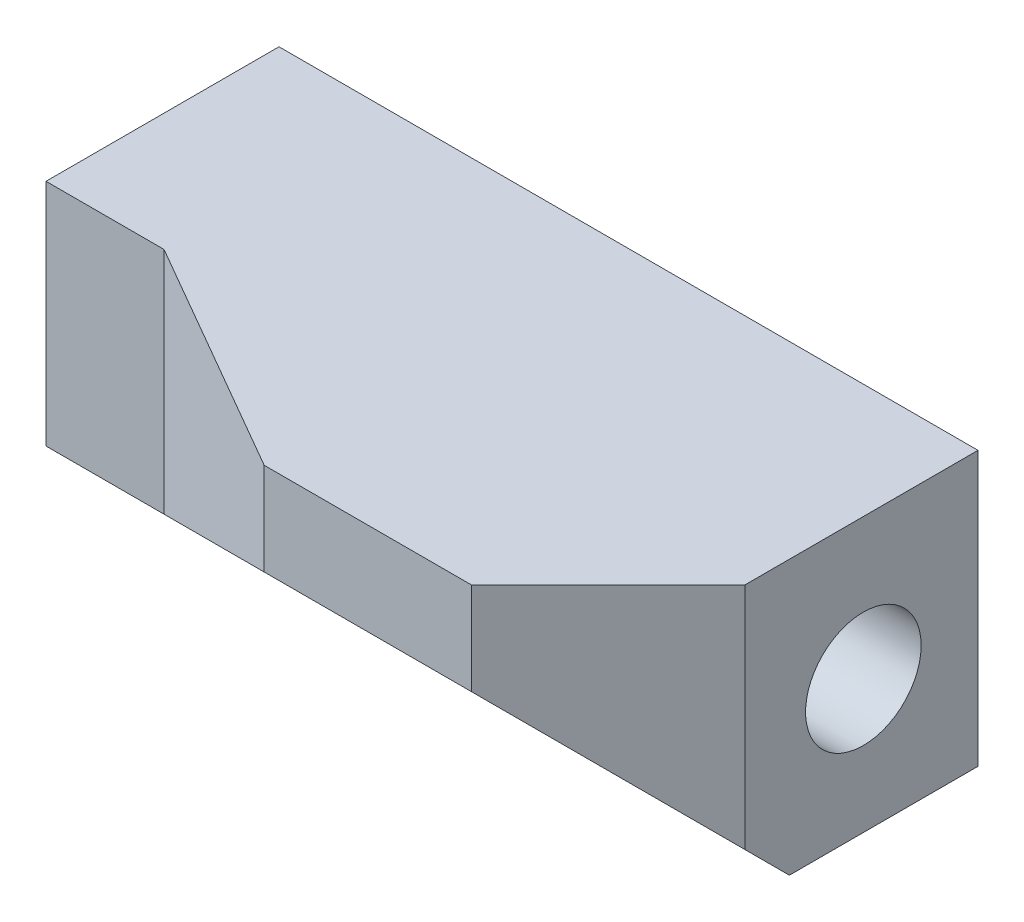
ISO-10303-21;
HEADER;
FILE_DESCRIPTION(('STEP AP214'),'2;1');
FILE_NAME('part.step','',(''),(''),'','','');
FILE_SCHEMA(('AUTOMOTIVE_DESIGN { 1 0 10303 214 1 1 1 1 }'));
ENDSEC;
DATA;
#1=APPLICATION_CONTEXT('core data for automotive mechanical design processes');
#2=APPLICATION_PROTOCOL_DEFINITION('international standard','automotive_design',2000,#1);
#3=PRODUCT_CONTEXT('',#1,'mechanical');
#4=PRODUCT('Part','Part','',(#3));
#5=PRODUCT_RELATED_PRODUCT_CATEGORY('part','',(#4));
#6=PRODUCT_DEFINITION_FORMATION('','',#4);
#7=PRODUCT_DEFINITION_CONTEXT('part definition',#1,'design');
#8=PRODUCT_DEFINITION('design','',#6,#7);
#9=PRODUCT_DEFINITION_SHAPE('','',#8);
#10=(LENGTH_UNIT() NAMED_UNIT(*) SI_UNIT(.MILLI.,.METRE.));
#11=(NAMED_UNIT(*) PLANE_ANGLE_UNIT() SI_UNIT($,.RADIAN.));
#12=(NAMED_UNIT(*) SI_UNIT($,.STERADIAN.) SOLID_ANGLE_UNIT());
#13=UNCERTAINTY_MEASURE_WITH_UNIT(LENGTH_MEASURE(1.E-05),#10,'distance_accuracy_value','');
#14=(GEOMETRIC_REPRESENTATION_CONTEXT(3) GLOBAL_UNCERTAINTY_ASSIGNED_CONTEXT((#13)) GLOBAL_UNIT_ASSIGNED_CONTEXT((#10,
#11,#12)) REPRESENTATION_CONTEXT('',''));
#15=CARTESIAN_POINT('',(0.,0.,0.));
#16=DIRECTION('',(0.,0.,1.));
#17=DIRECTION('',(1.,0.,0.));
#18=AXIS2_PLACEMENT_3D('',#15,#16,#17);
#19=CARTESIAN_POINT('',(-96.012,-31.75,31.7499999999999));
#20=DIRECTION('',(0.,-0.707106781186549,0.707106781186546));
#21=DIRECTION('',(0.,-0.707106781186546,-0.707106781186549));
#22=AXIS2_PLACEMENT_3D('',#19,#20,#21);
#23=PLANE('',#22);
#24=DIRECTION('',(0.,-0.707106781186546,-0.707106781186549));
#25=VECTOR('',#24,1.);
#26=CARTESIAN_POINT('',(0.,-31.75,31.7499999999999));
#27=LINE('',#26,#25);
#28=CARTESIAN_POINT('',(0.,-31.496,32.0039999999999));
#29=VERTEX_POINT('',#28);
#30=CARTESIAN_POINT('',(0.,-37.592,25.9079999999999));
#31=VERTEX_POINT('',#30);
#32=EDGE_CURVE('E198',#29,#31,#27,.T.);
#33=ORIENTED_EDGE('',*,*,#32,.F.);
#34=DIRECTION('',(-0.577350269189625,0.577350269189625,0.577350269189627));
#35=VECTOR('',#34,1.);
#36=CARTESIAN_POINT('',(-31.8346666666666,0.33866666666655,63.8386666666666));
#37=LINE('',#36,#35);
#38=CARTESIAN_POINT('',(-18.796,-12.7,50.8));
#39=VERTEX_POINT('',#38);
#40=EDGE_CURVE('E263',#29,#39,#37,.T.);
#41=ORIENTED_EDGE('',*,*,#40,.T.);
#42=DIRECTION('',(1.,0.,0.));
#43=VECTOR('',#42,1.);
#44=CARTESIAN_POINT('',(-96.012,-12.7,50.8));
#45=LINE('',#44,#43);
#46=CARTESIAN_POINT('',(-47.244,-12.7,50.8));
#47=VERTEX_POINT('',#46);
#48=EDGE_CURVE('E162',#47,#39,#45,.T.);
#49=ORIENTED_EDGE('',*,*,#48,.F.);
#50=DIRECTION('',(0.774596669241488,0.447213595499953,0.447213595499955));
#51=VECTOR('',#50,1.);
#52=CARTESIAN_POINT('',(-89.7030271536752,-37.2137307567036,26.2862692432963));
#53=LINE('',#52,#51);
#54=CARTESIAN_POINT('',(-79.7996269790651,-31.4959999999999,32.004));
#55=VERTEX_POINT('',#54);
#56=EDGE_CURVE('E288',#55,#47,#53,.T.);
#57=ORIENTED_EDGE('',*,*,#56,.F.);
#58=DIRECTION('',(1.,0.,0.));
#59=VECTOR('',#58,1.);
#60=CARTESIAN_POINT('',(-96.012,-31.4959999999999,32.004));
#61=LINE('',#60,#59);
#62=CARTESIAN_POINT('',(-96.012,-31.4959999999999,32.004));
#63=VERTEX_POINT('',#62);
#64=EDGE_CURVE('E291',#63,#55,#61,.T.);
#65=ORIENTED_EDGE('',*,*,#64,.F.);
#66=DIRECTION('',(0.,-0.707106781186546,-0.707106781186549));
#67=VECTOR('',#66,1.);
#68=CARTESIAN_POINT('',(-96.012,-31.75,31.7499999999999));
#69=LINE('',#68,#67);
#70=CARTESIAN_POINT('',(-96.012,-56.896,6.60399999999982));
#71=VERTEX_POINT('',#70);
#72=EDGE_CURVE('E209',#63,#71,#69,.T.);
#73=ORIENTED_EDGE('',*,*,#72,.T.);
#74=DIRECTION('',(1.,0.,0.));
#75=VECTOR('',#74,1.);
#76=CARTESIAN_POINT('',(-96.012,-56.896,6.60399999999982));
#77=LINE('',#76,#75);
#78=CARTESIAN_POINT('',(-70.612,-56.896,6.60399999999982));
#79=VERTEX_POINT('',#78);
#80=EDGE_CURVE('E186',#71,#79,#77,.T.);
#81=ORIENTED_EDGE('',*,*,#80,.T.);
#82=DIRECTION('',(0.,-0.707106781186546,-0.707106781186549));
#83=VECTOR('',#82,1.);
#84=CARTESIAN_POINT('',(-70.612,-31.75,31.7499999999999));
#85=LINE('',#84,#83);
#86=CARTESIAN_POINT('',(-70.612,-43.18,20.3199999999999));
#87=VERTEX_POINT('',#86);
#88=EDGE_CURVE('E233',#87,#79,#85,.T.);
#89=ORIENTED_EDGE('',*,*,#88,.F.);
#90=DIRECTION('',(-1.,0.,0.));
#91=VECTOR('',#90,1.);
#92=CARTESIAN_POINT('',(-96.012,-43.18,20.3199999999999));
#93=LINE('',#92,#91);
#94=CARTESIAN_POINT('',(-41.656,-43.18,20.3199999999999));
#95=VERTEX_POINT('',#94);
#96=EDGE_CURVE('E227',#95,#87,#93,.T.);
#97=ORIENTED_EDGE('',*,*,#96,.F.);
#98=DIRECTION('',(0.,0.707106781186546,0.707106781186549));
#99=VECTOR('',#98,1.);
#100=CARTESIAN_POINT('',(-41.656,-31.75,31.7499999999999));
#101=LINE('',#100,#99);
#102=CARTESIAN_POINT('',(-41.656,-56.896,6.60399999999983));
#103=VERTEX_POINT('',#102);
#104=EDGE_CURVE('E236',#103,#95,#101,.T.);
#105=ORIENTED_EDGE('',*,*,#104,.F.);
#106=CARTESIAN_POINT('',(-25.4,-56.896,6.60399999999982));
#107=VERTEX_POINT('',#106);
#108=EDGE_CURVE('E174',#103,#107,#77,.T.);
#109=ORIENTED_EDGE('',*,*,#108,.T.);
#110=DIRECTION('',(0.,0.707106781186546,0.707106781186549));
#111=VECTOR('',#110,1.);
#112=CARTESIAN_POINT('',(-25.4,-31.75,31.7499999999999));
#113=LINE('',#112,#111);
#114=CARTESIAN_POINT('',(-25.4,-37.592,25.9079999999999));
#115=VERTEX_POINT('',#114);
#116=EDGE_CURVE('E239',#107,#115,#113,.T.);
#117=ORIENTED_EDGE('',*,*,#116,.T.);
#118=DIRECTION('',(1.,0.,0.));
#119=VECTOR('',#118,1.);
#120=CARTESIAN_POINT('',(-96.012,-37.592,25.9079999999999));
#121=LINE('',#120,#119);
#122=EDGE_CURVE('E243',#115,#31,#121,.T.);
#123=ORIENTED_EDGE('',*,*,#122,.T.);
#124=EDGE_LOOP('',(#33,#41,#49,#57,#65,#73,#81,#89,#97,#105,#109,#117,#123));
#125=FACE_BOUND('',#124,.T.);
#126=ADVANCED_FACE('F45',(#125),#23,.T.);
#127=CARTESIAN_POINT('',(0.,0.,0.));
#128=DIRECTION('',(1.,0.,0.));
#129=DIRECTION('',(0.,0.,-1.));
#130=AXIS2_PLACEMENT_3D('',#127,#128,#129);
#131=PLANE('',#130);
#132=CARTESIAN_POINT('',(0.,-19.304,15.748));
#133=DIRECTION('',(1.,0.,0.));
#134=DIRECTION('',(0.,0.,-1.));
#135=AXIS2_PLACEMENT_3D('',#132,#133,#134);
#136=CIRCLE('',#135,7.9375);
#137=CARTESIAN_POINT('',(0.,-19.304,7.8105));
#138=VERTEX_POINT('',#137);
#139=EDGE_CURVE('E223',#138,#138,#136,.T.);
#140=ORIENTED_EDGE('',*,*,#139,.F.);
#141=EDGE_LOOP('',(#140));
#142=FACE_BOUND('',#141,.T.);
#143=DIRECTION('',(0.,0.,1.));
#144=VECTOR('',#143,1.);
#145=CARTESIAN_POINT('',(0.,0.,0.));
#146=LINE('',#145,#144);
#147=CARTESIAN_POINT('',(0.,0.,0.));
#148=VERTEX_POINT('',#147);
#149=CARTESIAN_POINT('',(0.,0.,32.0039999999999));
#150=VERTEX_POINT('',#149);
#151=EDGE_CURVE('E202',#148,#150,#146,.T.);
#152=ORIENTED_EDGE('',*,*,#151,.T.);
#153=DIRECTION('',(0.,1.,0.));
#154=VECTOR('',#153,1.);
#155=CARTESIAN_POINT('',(0.,-56.896,32.0039999999999));
#156=LINE('',#155,#154);
#157=EDGE_CURVE('E61',#29,#150,#156,.T.);
#158=ORIENTED_EDGE('',*,*,#157,.F.);
#159=ORIENTED_EDGE('',*,*,#32,.T.);
#160=DIRECTION('',(0.,0.,-1.));
#161=VECTOR('',#160,1.);
#162=CARTESIAN_POINT('',(0.,-37.592,0.));
#163=LINE('',#162,#161);
#164=CARTESIAN_POINT('',(0.,-37.592,0.));
#165=VERTEX_POINT('',#164);
#166=EDGE_CURVE('E54',#31,#165,#163,.T.);
#167=ORIENTED_EDGE('',*,*,#166,.T.);
#168=DIRECTION('',(0.,1.,0.));
#169=VECTOR('',#168,1.);
#170=CARTESIAN_POINT('',(0.,0.,0.));
#171=LINE('',#170,#169);
#172=EDGE_CURVE('E205',#165,#148,#171,.T.);
#173=ORIENTED_EDGE('',*,*,#172,.T.);
#174=EDGE_LOOP('',(#152,#158,#159,#167,#173));
#175=FACE_BOUND('',#174,.T.);
#176=ADVANCED_FACE('F338',(#142,#175),#131,.T.);
#177=CARTESIAN_POINT('',(-96.012,0.,50.8));
#178=DIRECTION('',(0.,0.,1.));
#179=DIRECTION('',(1.,0.,0.));
#180=AXIS2_PLACEMENT_3D('',#177,#178,#179);
#181=PLANE('',#180);
#182=ORIENTED_EDGE('',*,*,#48,.T.);
#183=DIRECTION('',(0.,1.,0.));
#184=VECTOR('',#183,1.);
#185=CARTESIAN_POINT('',(-18.796,-56.896,50.8));
#186=LINE('',#185,#184);
#187=CARTESIAN_POINT('',(-18.796,0.,50.8));
#188=VERTEX_POINT('',#187);
#189=EDGE_CURVE('E146',#39,#188,#186,.T.);
#190=ORIENTED_EDGE('',*,*,#189,.T.);
#191=DIRECTION('',(1.,0.,0.));
#192=VECTOR('',#191,1.);
#193=CARTESIAN_POINT('',(-96.012,0.,50.8));
#194=LINE('',#193,#192);
#195=CARTESIAN_POINT('',(-47.244,0.,50.8));
#196=VERTEX_POINT('',#195);
#197=EDGE_CURVE('E160',#196,#188,#194,.T.);
#198=ORIENTED_EDGE('',*,*,#197,.F.);
#199=DIRECTION('',(0.,1.,0.));
#200=VECTOR('',#199,1.);
#201=CARTESIAN_POINT('',(-47.244,-56.896,50.8));
#202=LINE('',#201,#200);
#203=EDGE_CURVE('E153',#47,#196,#202,.T.);
#204=ORIENTED_EDGE('',*,*,#203,.F.);
#205=EDGE_LOOP('',(#182,#190,#198,#204));
#206=FACE_BOUND('',#205,.T.);
#207=ADVANCED_FACE('F158',(#206),#181,.T.);
#208=CARTESIAN_POINT('',(-96.012,0.,0.));
#209=DIRECTION('',(0.,1.,0.));
#210=DIRECTION('',(0.,0.,1.));
#211=AXIS2_PLACEMENT_3D('',#208,#209,#210);
#212=PLANE('',#211);
#213=ORIENTED_EDGE('',*,*,#197,.T.);
#214=DIRECTION('',(0.707106781186546,0.,-0.707106781186549));
#215=VECTOR('',#214,1.);
#216=CARTESIAN_POINT('',(16.002,0.,16.0019999999999));
#217=LINE('',#216,#215);
#218=EDGE_CURVE('E143',#188,#150,#217,.T.);
#219=ORIENTED_EDGE('',*,*,#218,.T.);
#220=ORIENTED_EDGE('',*,*,#151,.F.);
#221=DIRECTION('',(1.,0.,0.));
#222=VECTOR('',#221,1.);
#223=CARTESIAN_POINT('',(-96.012,0.,0.));
#224=LINE('',#223,#222);
#225=CARTESIAN_POINT('',(-96.012,0.,0.));
#226=VERTEX_POINT('',#225);
#227=EDGE_CURVE('E170',#226,#148,#224,.T.);
#228=ORIENTED_EDGE('',*,*,#227,.F.);
#229=DIRECTION('',(0.,0.,1.));
#230=VECTOR('',#229,1.);
#231=CARTESIAN_POINT('',(-96.012,0.,0.));
#232=LINE('',#231,#230);
#233=CARTESIAN_POINT('',(-96.012,0.,32.004));
#234=VERTEX_POINT('',#233);
#235=EDGE_CURVE('E212',#226,#234,#232,.T.);
#236=ORIENTED_EDGE('',*,*,#235,.T.);
#237=DIRECTION('',(-1.,0.,0.));
#238=VECTOR('',#237,1.);
#239=CARTESIAN_POINT('',(0.,0.,32.004));
#240=LINE('',#239,#238);
#241=CARTESIAN_POINT('',(-79.7996269790651,0.,32.004));
#242=VERTEX_POINT('',#241);
#243=EDGE_CURVE('E69',#242,#234,#240,.T.);
#244=ORIENTED_EDGE('',*,*,#243,.F.);
#245=DIRECTION('',(-0.866025403784442,0.,-0.499999999999995));
#246=VECTOR('',#245,1.);
#247=CARTESIAN_POINT('',(-33.8080452561243,0.,58.5572520881961));
#248=LINE('',#247,#246);
#249=EDGE_CURVE('E168',#196,#242,#248,.T.);
#250=ORIENTED_EDGE('',*,*,#249,.F.);
#251=EDGE_LOOP('',(#213,#219,#220,#228,#236,#244,#250));
#252=FACE_BOUND('',#251,.T.);
#253=ADVANCED_FACE('F166',(#252),#212,.T.);
#254=CARTESIAN_POINT('',(-96.012,-56.896,0.));
#255=DIRECTION('',(0.,-1.,0.));
#256=DIRECTION('',(0.,0.,-1.));
#257=AXIS2_PLACEMENT_3D('',#254,#255,#256);
#258=PLANE('',#257);
#259=DIRECTION('',(0.,0.,-1.));
#260=VECTOR('',#259,1.);
#261=CARTESIAN_POINT('',(-70.612,-56.896,50.8));
#262=LINE('',#261,#260);
#263=CARTESIAN_POINT('',(-70.612,-56.896,0.));
#264=VERTEX_POINT('',#263);
#265=EDGE_CURVE('E273',#79,#264,#262,.T.);
#266=ORIENTED_EDGE('',*,*,#265,.F.);
#267=ORIENTED_EDGE('',*,*,#80,.F.);
#268=DIRECTION('',(0.,0.,-1.));
#269=VECTOR('',#268,1.);
#270=CARTESIAN_POINT('',(-96.012,-56.896,0.));
#271=LINE('',#270,#269);
#272=CARTESIAN_POINT('',(-96.012,-56.896,0.));
#273=VERTEX_POINT('',#272);
#274=EDGE_CURVE('E201',#71,#273,#271,.T.);
#275=ORIENTED_EDGE('',*,*,#274,.T.);
#276=DIRECTION('',(1.,0.,0.));
#277=VECTOR('',#276,1.);
#278=CARTESIAN_POINT('',(-96.012,-56.896,0.));
#279=LINE('',#278,#277);
#280=EDGE_CURVE('E177',#273,#264,#279,.T.);
#281=ORIENTED_EDGE('',*,*,#280,.T.);
#282=EDGE_LOOP('',(#266,#267,#275,#281));
#283=FACE_BOUND('',#282,.T.);
#284=ADVANCED_FACE('F47',(#283),#258,.T.);
#285=DIRECTION('',(0.,0.,-1.));
#286=VECTOR('',#285,1.);
#287=CARTESIAN_POINT('',(-41.656,-56.896,50.8));
#288=LINE('',#287,#286);
#289=CARTESIAN_POINT('',(-41.656,-56.896,0.));
#290=VERTEX_POINT('',#289);
#291=EDGE_CURVE('E268',#103,#290,#288,.T.);
#292=ORIENTED_EDGE('',*,*,#291,.T.);
#293=CARTESIAN_POINT('',(-25.4,-56.896,0.));
#294=VERTEX_POINT('',#293);
#295=EDGE_CURVE('E183',#290,#294,#279,.T.);
#296=ORIENTED_EDGE('',*,*,#295,.T.);
#297=DIRECTION('',(0.,0.,-1.));
#298=VECTOR('',#297,1.);
#299=CARTESIAN_POINT('',(-25.4,-56.896,50.8));
#300=LINE('',#299,#298);
#301=EDGE_CURVE('E251',#107,#294,#300,.T.);
#302=ORIENTED_EDGE('',*,*,#301,.F.);
#303=ORIENTED_EDGE('',*,*,#108,.F.);
#304=EDGE_LOOP('',(#292,#296,#302,#303));
#305=FACE_BOUND('',#304,.T.);
#306=ADVANCED_FACE('F309',(#305),#258,.T.);
#307=CARTESIAN_POINT('',(-96.012,0.,0.));
#308=DIRECTION('',(0.,0.,-1.));
#309=DIRECTION('',(-1.,0.,0.));
#310=AXIS2_PLACEMENT_3D('',#307,#308,#309);
#311=PLANE('',#310);
#312=DIRECTION('',(0.,1.,0.));
#313=VECTOR('',#312,1.);
#314=CARTESIAN_POINT('',(-70.612,0.,0.));
#315=LINE('',#314,#313);
#316=CARTESIAN_POINT('',(-70.612,-43.18,0.));
#317=VERTEX_POINT('',#316);
#318=EDGE_CURVE('E269',#264,#317,#315,.T.);
#319=ORIENTED_EDGE('',*,*,#318,.F.);
#320=ORIENTED_EDGE('',*,*,#280,.F.);
#321=DIRECTION('',(0.,1.,0.));
#322=VECTOR('',#321,1.);
#323=CARTESIAN_POINT('',(-96.012,0.,0.));
#324=LINE('',#323,#322);
#325=EDGE_CURVE('E216',#273,#226,#324,.T.);
#326=ORIENTED_EDGE('',*,*,#325,.T.);
#327=ORIENTED_EDGE('',*,*,#227,.T.);
#328=ORIENTED_EDGE('',*,*,#172,.F.);
#329=DIRECTION('',(-1.,0.,0.));
#330=VECTOR('',#329,1.);
#331=CARTESIAN_POINT('',(0.,-37.592,0.));
#332=LINE('',#331,#330);
#333=CARTESIAN_POINT('',(-25.4,-37.592,0.));
#334=VERTEX_POINT('',#333);
#335=EDGE_CURVE('E252',#165,#334,#332,.T.);
#336=ORIENTED_EDGE('',*,*,#335,.T.);
#337=DIRECTION('',(0.,-1.,0.));
#338=VECTOR('',#337,1.);
#339=CARTESIAN_POINT('',(-25.4,0.,0.));
#340=LINE('',#339,#338);
#341=EDGE_CURVE('E259',#334,#294,#340,.T.);
#342=ORIENTED_EDGE('',*,*,#341,.T.);
#343=ORIENTED_EDGE('',*,*,#295,.F.);
#344=DIRECTION('',(0.,-1.,0.));
#345=VECTOR('',#344,1.);
#346=CARTESIAN_POINT('',(-41.656,0.,0.));
#347=LINE('',#346,#345);
#348=CARTESIAN_POINT('',(-41.656,-43.18,0.));
#349=VERTEX_POINT('',#348);
#350=EDGE_CURVE('E281',#349,#290,#347,.T.);
#351=ORIENTED_EDGE('',*,*,#350,.F.);
#352=DIRECTION('',(1.,0.,0.));
#353=VECTOR('',#352,1.);
#354=CARTESIAN_POINT('',(0.,-43.18,0.));
#355=LINE('',#354,#353);
#356=EDGE_CURVE('E255',#317,#349,#355,.T.);
#357=ORIENTED_EDGE('',*,*,#356,.F.);
#358=EDGE_LOOP('',(#319,#320,#326,#327,#328,#336,#342,#343,#351,#357));
#359=FACE_BOUND('',#358,.T.);
#360=ADVANCED_FACE('F314',(#359),#311,.T.);
#361=CARTESIAN_POINT('',(-96.012,0.,0.));
#362=DIRECTION('',(1.,0.,0.));
#363=DIRECTION('',(0.,0.,-1.));
#364=AXIS2_PLACEMENT_3D('',#361,#362,#363);
#365=PLANE('',#364);
#366=ORIENTED_EDGE('',*,*,#72,.F.);
#367=DIRECTION('',(0.,1.,0.));
#368=VECTOR('',#367,1.);
#369=CARTESIAN_POINT('',(-96.012,0.,32.004));
#370=LINE('',#369,#368);
#371=EDGE_CURVE('E11',#63,#234,#370,.T.);
#372=ORIENTED_EDGE('',*,*,#371,.T.);
#373=ORIENTED_EDGE('',*,*,#235,.F.);
#374=ORIENTED_EDGE('',*,*,#325,.F.);
#375=ORIENTED_EDGE('',*,*,#274,.F.);
#376=EDGE_LOOP('',(#366,#372,#373,#374,#375));
#377=FACE_BOUND('',#376,.T.);
#378=ADVANCED_FACE('F336',(#377),#365,.F.);
#379=CARTESIAN_POINT('',(-31.75,-19.304,15.748));
#380=DIRECTION('',(1.,0.,0.));
#381=DIRECTION('',(0.,0.,-1.));
#382=AXIS2_PLACEMENT_3D('',#379,#380,#381);
#383=CYLINDRICAL_SURFACE('',#382,7.9375);
#384=CARTESIAN_POINT('',(-31.75,-19.304,15.748));
#385=DIRECTION('',(1.,0.,0.));
#386=DIRECTION('',(0.,0.,-1.));
#387=AXIS2_PLACEMENT_3D('',#384,#385,#386);
#388=CIRCLE('',#387,7.9375);
#389=CARTESIAN_POINT('',(-31.75,-19.304,7.8105));
#390=VERTEX_POINT('',#389);
#391=EDGE_CURVE('E208',#390,#390,#388,.T.);
#392=ORIENTED_EDGE('',*,*,#391,.F.);
#393=EDGE_LOOP('',(#392));
#394=FACE_BOUND('',#393,.T.);
#395=ORIENTED_EDGE('',*,*,#139,.T.);
#396=EDGE_LOOP('',(#395));
#397=FACE_BOUND('',#396,.T.);
#398=ADVANCED_FACE('F372',(#394,#397),#383,.F.);
#399=CARTESIAN_POINT('',(-31.75,-19.304,15.748));
#400=DIRECTION('',(1.,0.,0.));
#401=DIRECTION('',(0.,0.,-1.));
#402=AXIS2_PLACEMENT_3D('',#399,#400,#401);
#403=PLANE('',#402);
#404=ORIENTED_EDGE('',*,*,#391,.T.);
#405=EDGE_LOOP('',(#404));
#406=FACE_BOUND('',#405,.T.);
#407=ADVANCED_FACE('F384',(#406),#403,.T.);
#408=CARTESIAN_POINT('',(-25.4,0.,50.8));
#409=DIRECTION('',(1.,0.,0.));
#410=DIRECTION('',(0.,1.,0.));
#411=AXIS2_PLACEMENT_3D('',#408,#409,#410);
#412=PLANE('',#411);
#413=ORIENTED_EDGE('',*,*,#301,.T.);
#414=ORIENTED_EDGE('',*,*,#341,.F.);
#415=DIRECTION('',(0.,0.,-1.));
#416=VECTOR('',#415,1.);
#417=CARTESIAN_POINT('',(-25.4,-37.592,50.8));
#418=LINE('',#417,#416);
#419=EDGE_CURVE('E248',#115,#334,#418,.T.);
#420=ORIENTED_EDGE('',*,*,#419,.F.);
#421=ORIENTED_EDGE('',*,*,#116,.F.);
#422=EDGE_LOOP('',(#413,#414,#420,#421));
#423=FACE_BOUND('',#422,.T.);
#424=ADVANCED_FACE('F319',(#423),#412,.T.);
#425=CARTESIAN_POINT('',(0.,-37.592,50.8));
#426=DIRECTION('',(0.,-1.,0.));
#427=DIRECTION('',(0.,0.,-1.));
#428=AXIS2_PLACEMENT_3D('',#425,#426,#427);
#429=PLANE('',#428);
#430=ORIENTED_EDGE('',*,*,#419,.T.);
#431=ORIENTED_EDGE('',*,*,#335,.F.);
#432=ORIENTED_EDGE('',*,*,#166,.F.);
#433=ORIENTED_EDGE('',*,*,#122,.F.);
#434=EDGE_LOOP('',(#430,#431,#432,#433));
#435=FACE_BOUND('',#434,.T.);
#436=ADVANCED_FACE('F467',(#435),#429,.T.);
#437=CARTESIAN_POINT('',(0.,-43.18,50.8));
#438=DIRECTION('',(0.,1.,0.));
#439=DIRECTION('',(-1.,0.,0.));
#440=AXIS2_PLACEMENT_3D('',#437,#438,#439);
#441=PLANE('',#440);
#442=ORIENTED_EDGE('',*,*,#96,.T.);
#443=DIRECTION('',(0.,0.,-1.));
#444=VECTOR('',#443,1.);
#445=CARTESIAN_POINT('',(-70.612,-43.18,50.8));
#446=LINE('',#445,#444);
#447=EDGE_CURVE('E247',#87,#317,#446,.T.);
#448=ORIENTED_EDGE('',*,*,#447,.T.);
#449=ORIENTED_EDGE('',*,*,#356,.T.);
#450=DIRECTION('',(0.,0.,-1.));
#451=VECTOR('',#450,1.);
#452=CARTESIAN_POINT('',(-41.656,-43.18,50.8));
#453=LINE('',#452,#451);
#454=EDGE_CURVE('E264',#95,#349,#453,.T.);
#455=ORIENTED_EDGE('',*,*,#454,.F.);
#456=EDGE_LOOP('',(#442,#448,#449,#455));
#457=FACE_BOUND('',#456,.T.);
#458=ADVANCED_FACE('F327',(#457),#441,.F.);
#459=CARTESIAN_POINT('',(-70.612,0.,50.8));
#460=DIRECTION('',(-1.,0.,0.));
#461=DIRECTION('',(0.,0.,1.));
#462=AXIS2_PLACEMENT_3D('',#459,#460,#461);
#463=PLANE('',#462);
#464=ORIENTED_EDGE('',*,*,#88,.T.);
#465=ORIENTED_EDGE('',*,*,#265,.T.);
#466=ORIENTED_EDGE('',*,*,#318,.T.);
#467=ORIENTED_EDGE('',*,*,#447,.F.);
#468=EDGE_LOOP('',(#464,#465,#466,#467));
#469=FACE_BOUND('',#468,.T.);
#470=ADVANCED_FACE('F450',(#469),#463,.F.);
#471=CARTESIAN_POINT('',(-41.656,0.,50.8));
#472=DIRECTION('',(1.,0.,0.));
#473=DIRECTION('',(0.,0.,-1.));
#474=AXIS2_PLACEMENT_3D('',#471,#472,#473);
#475=PLANE('',#474);
#476=ORIENTED_EDGE('',*,*,#104,.T.);
#477=ORIENTED_EDGE('',*,*,#454,.T.);
#478=ORIENTED_EDGE('',*,*,#350,.T.);
#479=ORIENTED_EDGE('',*,*,#291,.F.);
#480=EDGE_LOOP('',(#476,#477,#478,#479));
#481=FACE_BOUND('',#480,.T.);
#482=ADVANCED_FACE('F325',(#481),#475,.F.);
#483=CARTESIAN_POINT('',(-33.8080452561243,-56.896,58.5572520881961));
#484=DIRECTION('',(0.499999999999995,0.,-0.866025403784442));
#485=DIRECTION('',(-0.866025403784442,0.,-0.499999999999995));
#486=AXIS2_PLACEMENT_3D('',#483,#484,#485);
#487=PLANE('',#486);
#488=ORIENTED_EDGE('',*,*,#56,.T.);
#489=ORIENTED_EDGE('',*,*,#203,.T.);
#490=ORIENTED_EDGE('',*,*,#249,.T.);
#491=DIRECTION('',(0.,1.,0.));
#492=VECTOR('',#491,1.);
#493=CARTESIAN_POINT('',(-79.7996269790651,-56.896,32.004));
#494=LINE('',#493,#492);
#495=EDGE_CURVE('E294',#55,#242,#494,.T.);
#496=ORIENTED_EDGE('',*,*,#495,.F.);
#497=EDGE_LOOP('',(#488,#489,#490,#496));
#498=FACE_BOUND('',#497,.T.);
#499=ADVANCED_FACE('F343',(#498),#487,.F.);
#500=CARTESIAN_POINT('',(0.,-56.896,32.004));
#501=DIRECTION('',(0.,0.,-1.));
#502=DIRECTION('',(-1.,0.,0.));
#503=AXIS2_PLACEMENT_3D('',#500,#501,#502);
#504=PLANE('',#503);
#505=ORIENTED_EDGE('',*,*,#64,.T.);
#506=ORIENTED_EDGE('',*,*,#495,.T.);
#507=ORIENTED_EDGE('',*,*,#243,.T.);
#508=ORIENTED_EDGE('',*,*,#371,.F.);
#509=EDGE_LOOP('',(#505,#506,#507,#508));
#510=FACE_BOUND('',#509,.T.);
#511=ADVANCED_FACE('F344',(#510),#504,.F.);
#512=CARTESIAN_POINT('',(16.002,-56.896,16.0019999999999));
#513=DIRECTION('',(0.707106781186549,0.,0.707106781186546));
#514=DIRECTION('',(0.707106781186546,0.,-0.707106781186549));
#515=AXIS2_PLACEMENT_3D('',#512,#513,#514);
#516=PLANE('',#515);
#517=ORIENTED_EDGE('',*,*,#157,.T.);
#518=ORIENTED_EDGE('',*,*,#218,.F.);
#519=ORIENTED_EDGE('',*,*,#189,.F.);
#520=ORIENTED_EDGE('',*,*,#40,.F.);
#521=EDGE_LOOP('',(#517,#518,#519,#520));
#522=FACE_BOUND('',#521,.T.);
#523=ADVANCED_FACE('F145',(#522),#516,.T.);
#524=CLOSED_SHELL('',(#126,#176,#207,#253,#284,#306,#360,#378,#398,#407,#424,#436,#458,#470,
#482,#499,#511,#523));
#525=MANIFOLD_SOLID_BREP('B2',#524);
#526=ADVANCED_BREP_SHAPE_REPRESENTATION('',(#18,#525),#14);
#527=SHAPE_DEFINITION_REPRESENTATION(#9,#526);
ENDSEC;
END-ISO-10303-21;
